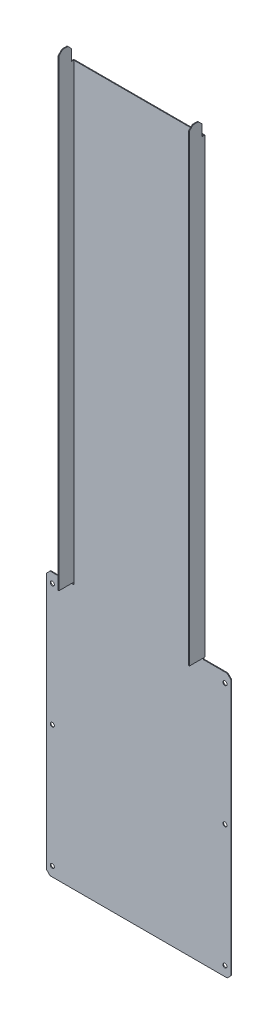
ISO-10303-21;
HEADER;
FILE_DESCRIPTION(('STEP AP214'),'2;1');
FILE_NAME('part.step','',(''),(''),'','','');
FILE_SCHEMA(('AUTOMOTIVE_DESIGN { 1 0 10303 214 1 1 1 1 }'));
ENDSEC;
DATA;
#1=APPLICATION_CONTEXT('core data for automotive mechanical design processes');
#2=APPLICATION_PROTOCOL_DEFINITION('international standard','automotive_design',2000,#1);
#3=PRODUCT_CONTEXT('',#1,'mechanical');
#4=PRODUCT('Part','Part','',(#3));
#5=PRODUCT_RELATED_PRODUCT_CATEGORY('part','',(#4));
#6=PRODUCT_DEFINITION_FORMATION('','',#4);
#7=PRODUCT_DEFINITION_CONTEXT('part definition',#1,'design');
#8=PRODUCT_DEFINITION('design','',#6,#7);
#9=PRODUCT_DEFINITION_SHAPE('','',#8);
#10=(LENGTH_UNIT() NAMED_UNIT(*) SI_UNIT(.MILLI.,.METRE.));
#11=(NAMED_UNIT(*) PLANE_ANGLE_UNIT() SI_UNIT($,.RADIAN.));
#12=(NAMED_UNIT(*) SI_UNIT($,.STERADIAN.) SOLID_ANGLE_UNIT());
#13=UNCERTAINTY_MEASURE_WITH_UNIT(LENGTH_MEASURE(1.E-05),#10,'distance_accuracy_value','');
#14=(GEOMETRIC_REPRESENTATION_CONTEXT(3) GLOBAL_UNCERTAINTY_ASSIGNED_CONTEXT((#13)) GLOBAL_UNIT_ASSIGNED_CONTEXT((#10,
#11,#12)) REPRESENTATION_CONTEXT('',''));
#15=CARTESIAN_POINT('',(0.,0.,0.));
#16=DIRECTION('',(0.,0.,1.));
#17=DIRECTION('',(1.,0.,0.));
#18=AXIS2_PLACEMENT_3D('',#15,#16,#17);
#19=CARTESIAN_POINT('',(87.5000000000001,181.,21.));
#20=DIRECTION('',(0.,-1.,0.));
#21=DIRECTION('',(0.,0.,-1.));
#22=AXIS2_PLACEMENT_3D('',#19,#20,#21);
#23=PLANE('',#22);
#24=DIRECTION('',(0.,0.,-1.));
#25=VECTOR('',#24,1.);
#26=CARTESIAN_POINT('',(87.5000000000002,181.,0.));
#27=LINE('',#26,#25);
#28=CARTESIAN_POINT('',(87.5000000000001,181.,0.));
#29=VERTEX_POINT('',#28);
#30=CARTESIAN_POINT('',(87.5000000000001,181.,1.));
#31=VERTEX_POINT('',#30);
#32=EDGE_CURVE('E310',#29,#31,#27,.F.);
#33=ORIENTED_EDGE('',*,*,#32,.F.);
#34=DIRECTION('',(1.,0.,0.));
#35=VECTOR('',#34,1.);
#36=CARTESIAN_POINT('',(88.0000000000001,181.,0.));
#37=LINE('',#36,#35);
#38=CARTESIAN_POINT('',(88.5000000000001,181.,0.));
#39=VERTEX_POINT('',#38);
#40=EDGE_CURVE('E361',#29,#39,#37,.T.);
#41=ORIENTED_EDGE('',*,*,#40,.T.);
#42=DIRECTION('',(0.,0.,1.));
#43=VECTOR('',#42,1.);
#44=CARTESIAN_POINT('',(88.5,181.,10.5));
#45=LINE('',#44,#43);
#46=CARTESIAN_POINT('',(88.5000000000001,181.,21.));
#47=VERTEX_POINT('',#46);
#48=EDGE_CURVE('E237',#39,#47,#45,.T.);
#49=ORIENTED_EDGE('',*,*,#48,.T.);
#50=DIRECTION('',(1.,0.,0.));
#51=VECTOR('',#50,1.);
#52=CARTESIAN_POINT('',(88.0000000000001,181.,21.));
#53=LINE('',#52,#51);
#54=CARTESIAN_POINT('',(87.5000000000001,181.,21.));
#55=VERTEX_POINT('',#54);
#56=EDGE_CURVE('E359',#55,#47,#53,.T.);
#57=ORIENTED_EDGE('',*,*,#56,.F.);
#58=DIRECTION('',(0.,0.,1.));
#59=VECTOR('',#58,1.);
#60=CARTESIAN_POINT('',(87.5000000000001,181.,11.));
#61=LINE('',#60,#59);
#62=EDGE_CURVE('E225',#31,#55,#61,.T.);
#63=ORIENTED_EDGE('',*,*,#62,.F.);
#64=EDGE_LOOP('',(#33,#41,#49,#57,#63));
#65=FACE_BOUND('',#64,.T.);
#66=ADVANCED_FACE('F16',(#65),#23,.T.);
#67=CARTESIAN_POINT('',(88.5000000000002,806.,21.));
#68=DIRECTION('',(0.,0.,1.));
#69=DIRECTION('',(-1.,0.,0.));
#70=AXIS2_PLACEMENT_3D('',#67,#68,#69);
#71=PLANE('',#70);
#72=DIRECTION('',(0.,1.,0.));
#73=VECTOR('',#72,1.);
#74=CARTESIAN_POINT('',(87.5000000000002,496.,21.));
#75=LINE('',#74,#73);
#76=CARTESIAN_POINT('',(87.5000000000002,806.,21.));
#77=VERTEX_POINT('',#76);
#78=EDGE_CURVE('E193',#55,#77,#75,.T.);
#79=ORIENTED_EDGE('',*,*,#78,.F.);
#80=ORIENTED_EDGE('',*,*,#56,.T.);
#81=DIRECTION('',(0.,1.,0.));
#82=VECTOR('',#81,1.);
#83=CARTESIAN_POINT('',(88.5000000000001,496.,21.));
#84=LINE('',#83,#82);
#85=CARTESIAN_POINT('',(88.5000000000002,806.,21.));
#86=VERTEX_POINT('',#85);
#87=EDGE_CURVE('E235',#47,#86,#84,.T.);
#88=ORIENTED_EDGE('',*,*,#87,.T.);
#89=DIRECTION('',(1.,0.,0.));
#90=VECTOR('',#89,1.);
#91=CARTESIAN_POINT('',(88.0000000000002,806.,21.));
#92=LINE('',#91,#90);
#93=EDGE_CURVE('E212',#77,#86,#92,.T.);
#94=ORIENTED_EDGE('',*,*,#93,.F.);
#95=EDGE_LOOP('',(#79,#80,#88,#94));
#96=FACE_BOUND('',#95,.T.);
#97=ADVANCED_FACE('F366',(#96),#71,.T.);
#98=CARTESIAN_POINT('',(88.5000000000002,811.,16.));
#99=DIRECTION('',(0.,0.70710678118655,0.707106781186545));
#100=DIRECTION('',(-1.,0.,0.));
#101=AXIS2_PLACEMENT_3D('',#98,#99,#100);
#102=PLANE('',#101);
#103=DIRECTION('',(0.,0.707106781186548,-0.707106781186547));
#104=VECTOR('',#103,1.);
#105=CARTESIAN_POINT('',(87.5000000000002,806.,21.));
#106=LINE('',#105,#104);
#107=CARTESIAN_POINT('',(87.5000000000002,811.,16.));
#108=VERTEX_POINT('',#107);
#109=EDGE_CURVE('E20',#77,#108,#106,.T.);
#110=ORIENTED_EDGE('',*,*,#109,.F.);
#111=ORIENTED_EDGE('',*,*,#93,.T.);
#112=DIRECTION('',(0.,-0.707106781186545,0.70710678118655));
#113=VECTOR('',#112,1.);
#114=CARTESIAN_POINT('',(88.5000000000002,811.,16.));
#115=LINE('',#114,#113);
#116=CARTESIAN_POINT('',(88.5000000000002,811.,16.));
#117=VERTEX_POINT('',#116);
#118=EDGE_CURVE('E207',#86,#117,#115,.F.);
#119=ORIENTED_EDGE('',*,*,#118,.T.);
#120=DIRECTION('',(1.,0.,0.));
#121=VECTOR('',#120,1.);
#122=CARTESIAN_POINT('',(88.0000000000002,811.,16.));
#123=LINE('',#122,#121);
#124=EDGE_CURVE('E204',#108,#117,#123,.T.);
#125=ORIENTED_EDGE('',*,*,#124,.F.);
#126=EDGE_LOOP('',(#110,#111,#119,#125));
#127=FACE_BOUND('',#126,.T.);
#128=ADVANCED_FACE('F205',(#127),#102,.T.);
#129=CARTESIAN_POINT('',(87.5000000000002,811.,9.));
#130=DIRECTION('',(0.,1.,0.));
#131=DIRECTION('',(0.,0.,1.));
#132=AXIS2_PLACEMENT_3D('',#129,#130,#131);
#133=PLANE('',#132);
#134=DIRECTION('',(0.,0.,-1.));
#135=VECTOR('',#134,1.);
#136=CARTESIAN_POINT('',(87.5000000000002,811.,11.));
#137=LINE('',#136,#135);
#138=CARTESIAN_POINT('',(87.5000000000002,811.,9.00000000000002));
#139=VERTEX_POINT('',#138);
#140=EDGE_CURVE('E200',#108,#139,#137,.T.);
#141=ORIENTED_EDGE('',*,*,#140,.F.);
#142=ORIENTED_EDGE('',*,*,#124,.T.);
#143=DIRECTION('',(0.,0.,-1.));
#144=VECTOR('',#143,1.);
#145=CARTESIAN_POINT('',(88.5000000000002,811.,10.5));
#146=LINE('',#145,#144);
#147=CARTESIAN_POINT('',(88.5000000000002,811.,9.00000000000004));
#148=VERTEX_POINT('',#147);
#149=EDGE_CURVE('E228',#117,#148,#146,.T.);
#150=ORIENTED_EDGE('',*,*,#149,.T.);
#151=DIRECTION('',(1.,0.,0.));
#152=VECTOR('',#151,1.);
#153=CARTESIAN_POINT('',(88.0000000000002,811.,9.00000000000004));
#154=LINE('',#153,#152);
#155=EDGE_CURVE('E211',#139,#148,#154,.T.);
#156=ORIENTED_EDGE('',*,*,#155,.F.);
#157=EDGE_LOOP('',(#141,#142,#150,#156));
#158=FACE_BOUND('',#157,.T.);
#159=ADVANCED_FACE('F214',(#158),#133,.T.);
#160=CARTESIAN_POINT('',(87.5000000000002,811.,9.00000000000004));
#161=DIRECTION('',(0.,0.70710678118655,-0.707106781186545));
#162=DIRECTION('',(1.,0.,0.));
#163=AXIS2_PLACEMENT_3D('',#160,#161,#162);
#164=PLANE('',#163);
#165=DIRECTION('',(0.,-0.707106781186548,-0.707106781186547));
#166=VECTOR('',#165,1.);
#167=CARTESIAN_POINT('',(87.5000000000002,811.,9.));
#168=LINE('',#167,#166);
#169=CARTESIAN_POINT('',(87.5000000000002,806.,4.));
#170=VERTEX_POINT('',#169);
#171=EDGE_CURVE('E216',#139,#170,#168,.T.);
#172=ORIENTED_EDGE('',*,*,#171,.F.);
#173=ORIENTED_EDGE('',*,*,#155,.T.);
#174=DIRECTION('',(0.,-0.707106781186545,-0.70710678118655));
#175=VECTOR('',#174,1.);
#176=CARTESIAN_POINT('',(88.5000000000002,811.,9.00000000000004));
#177=LINE('',#176,#175);
#178=CARTESIAN_POINT('',(88.5000000000002,806.,4.));
#179=VERTEX_POINT('',#178);
#180=EDGE_CURVE('E230',#148,#179,#177,.T.);
#181=ORIENTED_EDGE('',*,*,#180,.T.);
#182=DIRECTION('',(1.,0.,0.));
#183=VECTOR('',#182,1.);
#184=CARTESIAN_POINT('',(88.0000000000002,806.,4.));
#185=LINE('',#184,#183);
#186=EDGE_CURVE('E223',#170,#179,#185,.T.);
#187=ORIENTED_EDGE('',*,*,#186,.F.);
#188=EDGE_LOOP('',(#172,#173,#181,#187));
#189=FACE_BOUND('',#188,.T.);
#190=ADVANCED_FACE('F279',(#189),#164,.T.);
#191=CARTESIAN_POINT('',(87.5000000000002,806.,4.));
#192=DIRECTION('',(0.,0.,-1.));
#193=DIRECTION('',(1.,0.,0.));
#194=AXIS2_PLACEMENT_3D('',#191,#192,#193);
#195=PLANE('',#194);
#196=DIRECTION('',(0.,-1.,0.));
#197=VECTOR('',#196,1.);
#198=CARTESIAN_POINT('',(87.5000000000002,496.,4.));
#199=LINE('',#198,#197);
#200=CARTESIAN_POINT('',(87.5000000000002,791.,4.00000000000001));
#201=VERTEX_POINT('',#200);
#202=EDGE_CURVE('E218',#170,#201,#199,.T.);
#203=ORIENTED_EDGE('',*,*,#202,.F.);
#204=ORIENTED_EDGE('',*,*,#186,.T.);
#205=DIRECTION('',(0.,-1.,0.));
#206=VECTOR('',#205,1.);
#207=CARTESIAN_POINT('',(88.5000000000001,496.,4.));
#208=LINE('',#207,#206);
#209=CARTESIAN_POINT('',(88.5000000000002,791.,4.00000000000001));
#210=VERTEX_POINT('',#209);
#211=EDGE_CURVE('E231',#179,#210,#208,.T.);
#212=ORIENTED_EDGE('',*,*,#211,.T.);
#213=DIRECTION('',(-1.,0.,0.));
#214=VECTOR('',#213,1.);
#215=CARTESIAN_POINT('',(88.0000000000002,791.,4.00000000000001));
#216=LINE('',#215,#214);
#217=EDGE_CURVE('E222',#210,#201,#216,.T.);
#218=ORIENTED_EDGE('',*,*,#217,.T.);
#219=EDGE_LOOP('',(#203,#204,#212,#218));
#220=FACE_BOUND('',#219,.T.);
#221=ADVANCED_FACE('F287',(#220),#195,.T.);
#222=CARTESIAN_POINT('',(87.5000000000002,811.,21.));
#223=DIRECTION('',(-1.,0.,0.));
#224=DIRECTION('',(0.,0.,-1.));
#225=AXIS2_PLACEMENT_3D('',#222,#223,#224);
#226=PLANE('',#225);
#227=ORIENTED_EDGE('',*,*,#202,.T.);
#228=DIRECTION('',(0.,0.,1.));
#229=VECTOR('',#228,1.);
#230=CARTESIAN_POINT('',(87.5000000000002,791.,0.));
#231=LINE('',#230,#229);
#232=CARTESIAN_POINT('',(87.5000000000001,791.,1.));
#233=VERTEX_POINT('',#232);
#234=EDGE_CURVE('E291',#233,#201,#231,.T.);
#235=ORIENTED_EDGE('',*,*,#234,.F.);
#236=DIRECTION('',(0.,1.,0.));
#237=VECTOR('',#236,1.);
#238=CARTESIAN_POINT('',(87.5000000000001,296.924482555466,1.));
#239=LINE('',#238,#237);
#240=EDGE_CURVE('E330',#31,#233,#239,.T.);
#241=ORIENTED_EDGE('',*,*,#240,.F.);
#242=ORIENTED_EDGE('',*,*,#62,.T.);
#243=ORIENTED_EDGE('',*,*,#78,.T.);
#244=ORIENTED_EDGE('',*,*,#109,.T.);
#245=ORIENTED_EDGE('',*,*,#140,.T.);
#246=ORIENTED_EDGE('',*,*,#171,.T.);
#247=EDGE_LOOP('',(#227,#235,#241,#242,#243,#244,#245,#246));
#248=FACE_BOUND('',#247,.T.);
#249=ADVANCED_FACE('F198',(#248),#226,.T.);
#250=CARTESIAN_POINT('',(-87.5000000000002,494.50665867239,10.5526827030545));
#251=DIRECTION('',(1.,0.,0.));
#252=DIRECTION('',(0.,0.,-1.));
#253=AXIS2_PLACEMENT_3D('',#250,#251,#252);
#254=PLANE('',#253);
#255=DIRECTION('',(0.,1.,0.));
#256=VECTOR('',#255,1.);
#257=CARTESIAN_POINT('',(-87.5000000000001,806.,21.));
#258=LINE('',#257,#256);
#259=CARTESIAN_POINT('',(-87.5000000000001,181.,21.));
#260=VERTEX_POINT('',#259);
#261=CARTESIAN_POINT('',(-87.5000000000002,806.,21.));
#262=VERTEX_POINT('',#261);
#263=EDGE_CURVE('E342',#260,#262,#258,.T.);
#264=ORIENTED_EDGE('',*,*,#263,.F.);
#265=DIRECTION('',(0.,0.,-1.));
#266=VECTOR('',#265,1.);
#267=CARTESIAN_POINT('',(-87.5000000000001,181.,21.));
#268=LINE('',#267,#266);
#269=CARTESIAN_POINT('',(-87.5000000000001,181.,1.));
#270=VERTEX_POINT('',#269);
#271=EDGE_CURVE('E334',#270,#260,#268,.F.);
#272=ORIENTED_EDGE('',*,*,#271,.F.);
#273=DIRECTION('',(0.,1.,0.));
#274=VECTOR('',#273,1.);
#275=CARTESIAN_POINT('',(-87.5000000000002,296.924482555466,1.));
#276=LINE('',#275,#274);
#277=CARTESIAN_POINT('',(-87.5000000000002,791.,1.));
#278=VERTEX_POINT('',#277);
#279=EDGE_CURVE('E327',#278,#270,#276,.F.);
#280=ORIENTED_EDGE('',*,*,#279,.F.);
#281=DIRECTION('',(0.,0.,1.));
#282=VECTOR('',#281,1.);
#283=CARTESIAN_POINT('',(-87.5000000000002,791.,0.));
#284=LINE('',#283,#282);
#285=CARTESIAN_POINT('',(-87.5000000000002,791.,4.00000000000001));
#286=VERTEX_POINT('',#285);
#287=EDGE_CURVE('E444',#286,#278,#284,.F.);
#288=ORIENTED_EDGE('',*,*,#287,.F.);
#289=DIRECTION('',(0.,1.,0.));
#290=VECTOR('',#289,1.);
#291=CARTESIAN_POINT('',(-87.5000000000002,791.,4.00000000000001));
#292=LINE('',#291,#290);
#293=CARTESIAN_POINT('',(-87.5000000000002,806.,4.));
#294=VERTEX_POINT('',#293);
#295=EDGE_CURVE('E227',#294,#286,#292,.F.);
#296=ORIENTED_EDGE('',*,*,#295,.F.);
#297=DIRECTION('',(0.,0.707106781186548,0.707106781186547));
#298=VECTOR('',#297,1.);
#299=CARTESIAN_POINT('',(-87.5000000000002,806.,4.));
#300=LINE('',#299,#298);
#301=CARTESIAN_POINT('',(-87.5000000000002,811.,9.));
#302=VERTEX_POINT('',#301);
#303=EDGE_CURVE('E354',#302,#294,#300,.F.);
#304=ORIENTED_EDGE('',*,*,#303,.F.);
#305=DIRECTION('',(0.,0.,1.));
#306=VECTOR('',#305,1.);
#307=CARTESIAN_POINT('',(-87.5000000000002,811.,9.));
#308=LINE('',#307,#306);
#309=CARTESIAN_POINT('',(-87.5000000000002,811.,16.));
#310=VERTEX_POINT('',#309);
#311=EDGE_CURVE('E350',#310,#302,#308,.F.);
#312=ORIENTED_EDGE('',*,*,#311,.F.);
#313=DIRECTION('',(0.,-0.707106781186548,0.707106781186548));
#314=VECTOR('',#313,1.);
#315=CARTESIAN_POINT('',(-87.5000000000002,811.,16.));
#316=LINE('',#315,#314);
#317=EDGE_CURVE('E346',#262,#310,#316,.F.);
#318=ORIENTED_EDGE('',*,*,#317,.F.);
#319=EDGE_LOOP('',(#264,#272,#280,#288,#296,#304,#312,#318));
#320=FACE_BOUND('',#319,.T.);
#321=ADVANCED_FACE('F451',(#320),#254,.T.);
#322=CARTESIAN_POINT('',(-87.5000000000002,791.,4.00000000000001));
#323=DIRECTION('',(0.,0.,-1.));
#324=DIRECTION('',(-1.,0.,0.));
#325=AXIS2_PLACEMENT_3D('',#322,#323,#324);
#326=PLANE('',#325);
#327=ORIENTED_EDGE('',*,*,#295,.T.);
#328=DIRECTION('',(1.,0.,0.));
#329=VECTOR('',#328,1.);
#330=CARTESIAN_POINT('',(0.,791.,4.00000000000001));
#331=LINE('',#330,#329);
#332=CARTESIAN_POINT('',(-88.5000000000002,791.,4.00000000000001));
#333=VERTEX_POINT('',#332);
#334=EDGE_CURVE('E299',#333,#286,#331,.T.);
#335=ORIENTED_EDGE('',*,*,#334,.F.);
#336=DIRECTION('',(0.,1.,0.));
#337=VECTOR('',#336,1.);
#338=CARTESIAN_POINT('',(-88.5000000000001,494.50665867239,4.00000000000001));
#339=LINE('',#338,#337);
#340=CARTESIAN_POINT('',(-88.5000000000002,806.,4.));
#341=VERTEX_POINT('',#340);
#342=EDGE_CURVE('E441',#333,#341,#339,.T.);
#343=ORIENTED_EDGE('',*,*,#342,.T.);
#344=DIRECTION('',(1.,0.,0.));
#345=VECTOR('',#344,1.);
#346=CARTESIAN_POINT('',(-87.5000000000002,806.,4.));
#347=LINE('',#346,#345);
#348=EDGE_CURVE('E352',#294,#341,#347,.F.);
#349=ORIENTED_EDGE('',*,*,#348,.F.);
#350=EDGE_LOOP('',(#327,#335,#343,#349));
#351=FACE_BOUND('',#350,.T.);
#352=ADVANCED_FACE('F531',(#351),#326,.T.);
#353=CARTESIAN_POINT('',(-87.5000000000002,806.,4.));
#354=DIRECTION('',(0.,0.707106781186547,-0.707106781186548));
#355=DIRECTION('',(0.,0.707106781186548,0.707106781186547));
#356=AXIS2_PLACEMENT_3D('',#353,#354,#355);
#357=PLANE('',#356);
#358=ORIENTED_EDGE('',*,*,#303,.T.);
#359=ORIENTED_EDGE('',*,*,#348,.T.);
#360=DIRECTION('',(0.,0.707106781186548,0.707106781186547));
#361=VECTOR('',#360,1.);
#362=CARTESIAN_POINT('',(-88.5000000000001,806.,4.));
#363=LINE('',#362,#361);
#364=CARTESIAN_POINT('',(-88.5000000000002,811.,9.));
#365=VERTEX_POINT('',#364);
#366=EDGE_CURVE('E438',#341,#365,#363,.T.);
#367=ORIENTED_EDGE('',*,*,#366,.T.);
#368=DIRECTION('',(1.,0.,0.));
#369=VECTOR('',#368,1.);
#370=CARTESIAN_POINT('',(-87.5000000000002,811.,9.));
#371=LINE('',#370,#369);
#372=EDGE_CURVE('E348',#302,#365,#371,.F.);
#373=ORIENTED_EDGE('',*,*,#372,.F.);
#374=EDGE_LOOP('',(#358,#359,#367,#373));
#375=FACE_BOUND('',#374,.T.);
#376=ADVANCED_FACE('F530',(#375),#357,.T.);
#377=CARTESIAN_POINT('',(-87.5000000000002,811.,9.));
#378=DIRECTION('',(0.,1.,0.));
#379=DIRECTION('',(0.,0.,1.));
#380=AXIS2_PLACEMENT_3D('',#377,#378,#379);
#381=PLANE('',#380);
#382=ORIENTED_EDGE('',*,*,#311,.T.);
#383=ORIENTED_EDGE('',*,*,#372,.T.);
#384=DIRECTION('',(0.,0.,-1.));
#385=VECTOR('',#384,1.);
#386=CARTESIAN_POINT('',(-88.5000000000001,811.,10.5526827030545));
#387=LINE('',#386,#385);
#388=CARTESIAN_POINT('',(-88.5000000000002,811.,16.));
#389=VERTEX_POINT('',#388);
#390=EDGE_CURVE('E435',#365,#389,#387,.F.);
#391=ORIENTED_EDGE('',*,*,#390,.T.);
#392=DIRECTION('',(1.,0.,0.));
#393=VECTOR('',#392,1.);
#394=CARTESIAN_POINT('',(-87.5000000000002,811.,16.));
#395=LINE('',#394,#393);
#396=EDGE_CURVE('E344',#310,#389,#395,.F.);
#397=ORIENTED_EDGE('',*,*,#396,.F.);
#398=EDGE_LOOP('',(#382,#383,#391,#397));
#399=FACE_BOUND('',#398,.T.);
#400=ADVANCED_FACE('F526',(#399),#381,.T.);
#401=CARTESIAN_POINT('',(-87.5000000000002,811.,16.));
#402=DIRECTION('',(0.,0.707106781186548,0.707106781186548));
#403=DIRECTION('',(0.,-0.707106781186548,0.707106781186548));
#404=AXIS2_PLACEMENT_3D('',#401,#402,#403);
#405=PLANE('',#404);
#406=ORIENTED_EDGE('',*,*,#317,.T.);
#407=ORIENTED_EDGE('',*,*,#396,.T.);
#408=DIRECTION('',(0.,-0.707106781186548,0.707106781186547));
#409=VECTOR('',#408,1.);
#410=CARTESIAN_POINT('',(-88.5000000000001,811.,16.));
#411=LINE('',#410,#409);
#412=CARTESIAN_POINT('',(-88.5000000000002,806.,21.));
#413=VERTEX_POINT('',#412);
#414=EDGE_CURVE('E432',#389,#413,#411,.T.);
#415=ORIENTED_EDGE('',*,*,#414,.T.);
#416=DIRECTION('',(1.,0.,0.));
#417=VECTOR('',#416,1.);
#418=CARTESIAN_POINT('',(-87.5000000000002,806.,21.));
#419=LINE('',#418,#417);
#420=EDGE_CURVE('E340',#262,#413,#419,.F.);
#421=ORIENTED_EDGE('',*,*,#420,.F.);
#422=EDGE_LOOP('',(#406,#407,#415,#421));
#423=FACE_BOUND('',#422,.T.);
#424=ADVANCED_FACE('F522',(#423),#405,.T.);
#425=CARTESIAN_POINT('',(-87.5000000000002,806.,21.));
#426=DIRECTION('',(0.,0.,1.));
#427=DIRECTION('',(1.,0.,0.));
#428=AXIS2_PLACEMENT_3D('',#425,#426,#427);
#429=PLANE('',#428);
#430=ORIENTED_EDGE('',*,*,#263,.T.);
#431=ORIENTED_EDGE('',*,*,#420,.T.);
#432=DIRECTION('',(0.,1.,0.));
#433=VECTOR('',#432,1.);
#434=CARTESIAN_POINT('',(-88.5000000000001,494.50665867239,21.));
#435=LINE('',#434,#433);
#436=CARTESIAN_POINT('',(-88.5000000000001,181.,21.));
#437=VERTEX_POINT('',#436);
#438=EDGE_CURVE('E429',#413,#437,#435,.F.);
#439=ORIENTED_EDGE('',*,*,#438,.T.);
#440=DIRECTION('',(1.,0.,0.));
#441=VECTOR('',#440,1.);
#442=CARTESIAN_POINT('',(-87.5000000000001,181.,21.));
#443=LINE('',#442,#441);
#444=EDGE_CURVE('E332',#260,#437,#443,.F.);
#445=ORIENTED_EDGE('',*,*,#444,.F.);
#446=EDGE_LOOP('',(#430,#431,#439,#445));
#447=FACE_BOUND('',#446,.T.);
#448=ADVANCED_FACE('F516',(#447),#429,.T.);
#449=CARTESIAN_POINT('',(-87.5000000000001,181.,21.));
#450=DIRECTION('',(0.,-1.,0.));
#451=DIRECTION('',(0.,0.,-1.));
#452=AXIS2_PLACEMENT_3D('',#449,#450,#451);
#453=PLANE('',#452);
#454=ORIENTED_EDGE('',*,*,#271,.T.);
#455=ORIENTED_EDGE('',*,*,#444,.T.);
#456=DIRECTION('',(0.,0.,-1.));
#457=VECTOR('',#456,1.);
#458=CARTESIAN_POINT('',(-88.5000000000001,181.,10.5526827030545));
#459=LINE('',#458,#457);
#460=CARTESIAN_POINT('',(-88.5000000000001,181.,0.));
#461=VERTEX_POINT('',#460);
#462=EDGE_CURVE('E426',#437,#461,#459,.T.);
#463=ORIENTED_EDGE('',*,*,#462,.T.);
#464=DIRECTION('',(1.,0.,0.));
#465=VECTOR('',#464,1.);
#466=CARTESIAN_POINT('',(-87.5000000000001,181.,0.));
#467=LINE('',#466,#465);
#468=CARTESIAN_POINT('',(-87.5000000000001,181.,0.));
#469=VERTEX_POINT('',#468);
#470=EDGE_CURVE('E338',#461,#469,#467,.T.);
#471=ORIENTED_EDGE('',*,*,#470,.T.);
#472=DIRECTION('',(0.,0.,-1.));
#473=VECTOR('',#472,1.);
#474=CARTESIAN_POINT('',(-87.5000000000001,181.,21.));
#475=LINE('',#474,#473);
#476=EDGE_CURVE('E336',#469,#270,#475,.F.);
#477=ORIENTED_EDGE('',*,*,#476,.T.);
#478=EDGE_LOOP('',(#454,#455,#463,#471,#477));
#479=FACE_BOUND('',#478,.T.);
#480=ADVANCED_FACE('F513',(#479),#453,.T.);
#481=CARTESIAN_POINT('',(51.679387924832,296.924482555466,1.));
#482=DIRECTION('',(0.,0.,1.));
#483=DIRECTION('',(1.,0.,0.));
#484=AXIS2_PLACEMENT_3D('',#481,#482,#483);
#485=PLANE('',#484);
#486=CARTESIAN_POINT('',(-116.453,165.,0.99999999999989));
#487=DIRECTION('',(0.,0.,1.));
#488=DIRECTION('',(1.,0.,0.));
#489=AXIS2_PLACEMENT_3D('',#486,#487,#488);
#490=CIRCLE('',#489,2.75);
#491=CARTESIAN_POINT('',(-113.703,165.,0.99999999999989));
#492=VERTEX_POINT('',#491);
#493=EDGE_CURVE('E254',#492,#492,#490,.F.);
#494=ORIENTED_EDGE('',*,*,#493,.T.);
#495=EDGE_LOOP('',(#494));
#496=FACE_BOUND('',#495,.T.);
#497=CARTESIAN_POINT('',(-116.453,0.,0.99999999999989));
#498=DIRECTION('',(0.,0.,1.));
#499=DIRECTION('',(1.,0.,0.));
#500=AXIS2_PLACEMENT_3D('',#497,#498,#499);
#501=CIRCLE('',#500,2.75);
#502=CARTESIAN_POINT('',(-113.703,0.,0.99999999999989));
#503=VERTEX_POINT('',#502);
#504=EDGE_CURVE('E258',#503,#503,#501,.F.);
#505=ORIENTED_EDGE('',*,*,#504,.T.);
#506=EDGE_LOOP('',(#505));
#507=FACE_BOUND('',#506,.T.);
#508=CARTESIAN_POINT('',(-116.453,-165.,0.99999999999989));
#509=DIRECTION('',(0.,0.,1.));
#510=DIRECTION('',(1.,0.,0.));
#511=AXIS2_PLACEMENT_3D('',#508,#509,#510);
#512=CIRCLE('',#511,2.75);
#513=CARTESIAN_POINT('',(-113.703,-165.,0.99999999999989));
#514=VERTEX_POINT('',#513);
#515=EDGE_CURVE('E261',#514,#514,#512,.F.);
#516=ORIENTED_EDGE('',*,*,#515,.T.);
#517=EDGE_LOOP('',(#516));
#518=FACE_BOUND('',#517,.T.);
#519=CARTESIAN_POINT('',(116.453,165.,0.99999999999989));
#520=DIRECTION('',(0.,0.,1.));
#521=DIRECTION('',(1.,0.,0.));
#522=AXIS2_PLACEMENT_3D('',#519,#520,#521);
#523=CIRCLE('',#522,2.75);
#524=CARTESIAN_POINT('',(119.203,165.,0.99999999999989));
#525=VERTEX_POINT('',#524);
#526=EDGE_CURVE('E264',#525,#525,#523,.F.);
#527=ORIENTED_EDGE('',*,*,#526,.T.);
#528=EDGE_LOOP('',(#527));
#529=FACE_BOUND('',#528,.T.);
#530=CARTESIAN_POINT('',(116.453,0.,0.99999999999989));
#531=DIRECTION('',(0.,0.,1.));
#532=DIRECTION('',(1.,0.,0.));
#533=AXIS2_PLACEMENT_3D('',#530,#531,#532);
#534=CIRCLE('',#533,2.75);
#535=CARTESIAN_POINT('',(119.203,0.,0.99999999999989));
#536=VERTEX_POINT('',#535);
#537=EDGE_CURVE('E267',#536,#536,#534,.F.);
#538=ORIENTED_EDGE('',*,*,#537,.T.);
#539=EDGE_LOOP('',(#538));
#540=FACE_BOUND('',#539,.T.);
#541=CARTESIAN_POINT('',(116.453,-165.,0.99999999999989));
#542=DIRECTION('',(0.,0.,1.));
#543=DIRECTION('',(1.,0.,0.));
#544=AXIS2_PLACEMENT_3D('',#541,#542,#543);
#545=CIRCLE('',#544,2.75);
#546=CARTESIAN_POINT('',(119.203,-165.,0.99999999999989));
#547=VERTEX_POINT('',#546);
#548=EDGE_CURVE('E270',#547,#547,#545,.F.);
#549=ORIENTED_EDGE('',*,*,#548,.T.);
#550=EDGE_LOOP('',(#549));
#551=FACE_BOUND('',#550,.T.);
#552=DIRECTION('',(0.,1.,0.));
#553=VECTOR('',#552,1.);
#554=CARTESIAN_POINT('',(-124.5,-173.,1.));
#555=LINE('',#554,#553);
#556=CARTESIAN_POINT('',(-124.5,-173.,1.));
#557=VERTEX_POINT('',#556);
#558=CARTESIAN_POINT('',(-124.5,173.,1.));
#559=VERTEX_POINT('',#558);
#560=EDGE_CURVE('E410',#557,#559,#555,.T.);
#561=ORIENTED_EDGE('',*,*,#560,.F.);
#562=DIRECTION('',(0.707106781186548,-0.707106781186548,0.));
#563=VECTOR('',#562,1.);
#564=CARTESIAN_POINT('',(-119.5,-178.,1.));
#565=LINE('',#564,#563);
#566=CARTESIAN_POINT('',(-119.5,-178.,1.));
#567=VERTEX_POINT('',#566);
#568=EDGE_CURVE('E406',#567,#557,#565,.F.);
#569=ORIENTED_EDGE('',*,*,#568,.F.);
#570=DIRECTION('',(1.,0.,0.));
#571=VECTOR('',#570,1.);
#572=CARTESIAN_POINT('',(119.5,-178.,1.));
#573=LINE('',#572,#571);
#574=CARTESIAN_POINT('',(119.5,-178.,1.));
#575=VERTEX_POINT('',#574);
#576=EDGE_CURVE('E402',#575,#567,#573,.F.);
#577=ORIENTED_EDGE('',*,*,#576,.F.);
#578=DIRECTION('',(0.707106781186548,0.707106781186548,0.));
#579=VECTOR('',#578,1.);
#580=CARTESIAN_POINT('',(124.5,-173.,1.));
#581=LINE('',#580,#579);
#582=CARTESIAN_POINT('',(124.5,-173.,1.));
#583=VERTEX_POINT('',#582);
#584=EDGE_CURVE('E325',#583,#575,#581,.F.);
#585=ORIENTED_EDGE('',*,*,#584,.F.);
#586=DIRECTION('',(0.,1.,0.));
#587=VECTOR('',#586,1.);
#588=CARTESIAN_POINT('',(124.5,173.,1.));
#589=LINE('',#588,#587);
#590=CARTESIAN_POINT('',(124.5,173.,1.));
#591=VERTEX_POINT('',#590);
#592=EDGE_CURVE('E323',#591,#583,#589,.F.);
#593=ORIENTED_EDGE('',*,*,#592,.F.);
#594=DIRECTION('',(-0.707106781186548,0.707106781186548,0.));
#595=VECTOR('',#594,1.);
#596=CARTESIAN_POINT('',(119.5,178.,1.));
#597=LINE('',#596,#595);
#598=CARTESIAN_POINT('',(119.5,178.,1.));
#599=VERTEX_POINT('',#598);
#600=EDGE_CURVE('E319',#599,#591,#597,.F.);
#601=ORIENTED_EDGE('',*,*,#600,.F.);
#602=DIRECTION('',(1.,0.,0.));
#603=VECTOR('',#602,1.);
#604=CARTESIAN_POINT('',(87.5000000000001,178.,1.));
#605=LINE('',#604,#603);
#606=CARTESIAN_POINT('',(87.5000000000001,178.,1.));
#607=VERTEX_POINT('',#606);
#608=EDGE_CURVE('E315',#607,#599,#605,.T.);
#609=ORIENTED_EDGE('',*,*,#608,.F.);
#610=DIRECTION('',(0.,1.,0.));
#611=VECTOR('',#610,1.);
#612=CARTESIAN_POINT('',(87.5000000000002,791.,1.));
#613=LINE('',#612,#611);
#614=EDGE_CURVE('E308',#31,#607,#613,.F.);
#615=ORIENTED_EDGE('',*,*,#614,.F.);
#616=ORIENTED_EDGE('',*,*,#240,.T.);
#617=DIRECTION('',(1.,0.,0.));
#618=VECTOR('',#617,1.);
#619=CARTESIAN_POINT('',(0.,791.,1.));
#620=LINE('',#619,#618);
#621=EDGE_CURVE('E234',#278,#233,#620,.T.);
#622=ORIENTED_EDGE('',*,*,#621,.F.);
#623=ORIENTED_EDGE('',*,*,#279,.T.);
#624=DIRECTION('',(0.,1.,0.));
#625=VECTOR('',#624,1.);
#626=CARTESIAN_POINT('',(-87.5000000000001,178.,1.));
#627=LINE('',#626,#625);
#628=CARTESIAN_POINT('',(-87.5000000000001,178.,1.));
#629=VERTEX_POINT('',#628);
#630=EDGE_CURVE('E420',#629,#270,#627,.T.);
#631=ORIENTED_EDGE('',*,*,#630,.F.);
#632=DIRECTION('',(1.,0.,0.));
#633=VECTOR('',#632,1.);
#634=CARTESIAN_POINT('',(-119.5,178.,1.));
#635=LINE('',#634,#633);
#636=CARTESIAN_POINT('',(-119.5,178.,1.));
#637=VERTEX_POINT('',#636);
#638=EDGE_CURVE('E418',#637,#629,#635,.T.);
#639=ORIENTED_EDGE('',*,*,#638,.F.);
#640=DIRECTION('',(-0.707106781186548,-0.707106781186548,0.));
#641=VECTOR('',#640,1.);
#642=CARTESIAN_POINT('',(-124.5,173.,1.));
#643=LINE('',#642,#641);
#644=EDGE_CURVE('E414',#559,#637,#643,.F.);
#645=ORIENTED_EDGE('',*,*,#644,.F.);
#646=EDGE_LOOP('',(#561,#569,#577,#585,#593,#601,#609,#615,#616,#622,#623,#631,#639,#645));
#647=FACE_BOUND('',#646,.T.);
#648=ADVANCED_FACE('F458',(#496,#507,#518,#529,#540,#551,#647),#485,.T.);
#649=CARTESIAN_POINT('',(124.5,-173.,0.));
#650=DIRECTION('',(0.707106781186548,-0.707106781186548,0.));
#651=DIRECTION('',(0.707106781186548,0.707106781186548,0.));
#652=AXIS2_PLACEMENT_3D('',#649,#650,#651);
#653=PLANE('',#652);
#654=DIRECTION('',(0.707106781186546,0.707106781186548,0.));
#655=VECTOR('',#654,1.);
#656=CARTESIAN_POINT('',(119.5,-178.,0.));
#657=LINE('',#656,#655);
#658=CARTESIAN_POINT('',(119.5,-178.,0.));
#659=VERTEX_POINT('',#658);
#660=CARTESIAN_POINT('',(124.5,-173.,0.));
#661=VERTEX_POINT('',#660);
#662=EDGE_CURVE('E257',#659,#661,#657,.T.);
#663=ORIENTED_EDGE('',*,*,#662,.T.);
#664=DIRECTION('',(0.,0.,-1.));
#665=VECTOR('',#664,1.);
#666=CARTESIAN_POINT('',(124.5,-173.,0.));
#667=LINE('',#666,#665);
#668=EDGE_CURVE('E321',#583,#661,#667,.T.);
#669=ORIENTED_EDGE('',*,*,#668,.F.);
#670=ORIENTED_EDGE('',*,*,#584,.T.);
#671=DIRECTION('',(0.,0.,-1.));
#672=VECTOR('',#671,1.);
#673=CARTESIAN_POINT('',(119.5,-178.,0.));
#674=LINE('',#673,#672);
#675=EDGE_CURVE('E273',#659,#575,#674,.F.);
#676=ORIENTED_EDGE('',*,*,#675,.F.);
#677=EDGE_LOOP('',(#663,#669,#670,#676));
#678=FACE_BOUND('',#677,.T.);
#679=ADVANCED_FACE('F482',(#678),#653,.T.);
#680=CARTESIAN_POINT('',(124.5,173.,0.));
#681=DIRECTION('',(1.,0.,0.));
#682=DIRECTION('',(0.,0.,-1.));
#683=AXIS2_PLACEMENT_3D('',#680,#681,#682);
#684=PLANE('',#683);
#685=DIRECTION('',(0.,1.,0.));
#686=VECTOR('',#685,1.);
#687=CARTESIAN_POINT('',(124.5,296.924482555466,0.));
#688=LINE('',#687,#686);
#689=CARTESIAN_POINT('',(124.5,173.,0.));
#690=VERTEX_POINT('',#689);
#691=EDGE_CURVE('E394',#661,#690,#688,.T.);
#692=ORIENTED_EDGE('',*,*,#691,.T.);
#693=DIRECTION('',(0.,0.,1.));
#694=VECTOR('',#693,1.);
#695=CARTESIAN_POINT('',(124.5,173.,0.));
#696=LINE('',#695,#694);
#697=EDGE_CURVE('E317',#591,#690,#696,.F.);
#698=ORIENTED_EDGE('',*,*,#697,.F.);
#699=ORIENTED_EDGE('',*,*,#592,.T.);
#700=ORIENTED_EDGE('',*,*,#668,.T.);
#701=EDGE_LOOP('',(#692,#698,#699,#700));
#702=FACE_BOUND('',#701,.T.);
#703=ADVANCED_FACE('F478',(#702),#684,.T.);
#704=CARTESIAN_POINT('',(119.5,178.,0.));
#705=DIRECTION('',(0.707106781186548,0.707106781186548,0.));
#706=DIRECTION('',(-0.707106781186548,0.707106781186548,0.));
#707=AXIS2_PLACEMENT_3D('',#704,#705,#706);
#708=PLANE('',#707);
#709=DIRECTION('',(-0.707106781186548,0.707106781186547,0.));
#710=VECTOR('',#709,1.);
#711=CARTESIAN_POINT('',(124.5,173.,0.));
#712=LINE('',#711,#710);
#713=CARTESIAN_POINT('',(119.5,178.,0.));
#714=VERTEX_POINT('',#713);
#715=EDGE_CURVE('E391',#690,#714,#712,.T.);
#716=ORIENTED_EDGE('',*,*,#715,.T.);
#717=DIRECTION('',(0.,0.,1.));
#718=VECTOR('',#717,1.);
#719=CARTESIAN_POINT('',(119.5,178.,0.));
#720=LINE('',#719,#718);
#721=EDGE_CURVE('E313',#599,#714,#720,.F.);
#722=ORIENTED_EDGE('',*,*,#721,.F.);
#723=ORIENTED_EDGE('',*,*,#600,.T.);
#724=ORIENTED_EDGE('',*,*,#697,.T.);
#725=EDGE_LOOP('',(#716,#722,#723,#724));
#726=FACE_BOUND('',#725,.T.);
#727=ADVANCED_FACE('F473',(#726),#708,.T.);
#728=CARTESIAN_POINT('',(87.5000000000001,178.,0.));
#729=DIRECTION('',(0.,1.,0.));
#730=DIRECTION('',(0.,0.,1.));
#731=AXIS2_PLACEMENT_3D('',#728,#729,#730);
#732=PLANE('',#731);
#733=DIRECTION('',(1.,0.,0.));
#734=VECTOR('',#733,1.);
#735=CARTESIAN_POINT('',(51.679387924832,178.,0.));
#736=LINE('',#735,#734);
#737=CARTESIAN_POINT('',(87.5000000000001,178.,0.));
#738=VERTEX_POINT('',#737);
#739=EDGE_CURVE('E385',#714,#738,#736,.F.);
#740=ORIENTED_EDGE('',*,*,#739,.T.);
#741=DIRECTION('',(0.,0.,-1.));
#742=VECTOR('',#741,1.);
#743=CARTESIAN_POINT('',(87.5000000000002,178.,0.));
#744=LINE('',#743,#742);
#745=EDGE_CURVE('E306',#607,#738,#744,.T.);
#746=ORIENTED_EDGE('',*,*,#745,.F.);
#747=ORIENTED_EDGE('',*,*,#608,.T.);
#748=ORIENTED_EDGE('',*,*,#721,.T.);
#749=EDGE_LOOP('',(#740,#746,#747,#748));
#750=FACE_BOUND('',#749,.T.);
#751=ADVANCED_FACE('F470',(#750),#732,.T.);
#752=CARTESIAN_POINT('',(87.5000000000002,791.,0.));
#753=DIRECTION('',(1.,0.,0.));
#754=DIRECTION('',(0.,0.,-1.));
#755=AXIS2_PLACEMENT_3D('',#752,#753,#754);
#756=PLANE('',#755);
#757=ORIENTED_EDGE('',*,*,#745,.T.);
#758=DIRECTION('',(0.,1.,0.));
#759=VECTOR('',#758,1.);
#760=CARTESIAN_POINT('',(87.5000000000001,296.924482555466,0.));
#761=LINE('',#760,#759);
#762=EDGE_CURVE('E380',#738,#29,#761,.T.);
#763=ORIENTED_EDGE('',*,*,#762,.T.);
#764=ORIENTED_EDGE('',*,*,#32,.T.);
#765=ORIENTED_EDGE('',*,*,#614,.T.);
#766=EDGE_LOOP('',(#757,#763,#764,#765));
#767=FACE_BOUND('',#766,.T.);
#768=ADVANCED_FACE('F466',(#767),#756,.T.);
#769=CARTESIAN_POINT('',(88.5000000000002,811.,21.));
#770=DIRECTION('',(-1.,0.,0.));
#771=DIRECTION('',(0.,0.,-1.));
#772=AXIS2_PLACEMENT_3D('',#769,#770,#771);
#773=PLANE('',#772);
#774=ORIENTED_EDGE('',*,*,#211,.F.);
#775=ORIENTED_EDGE('',*,*,#180,.F.);
#776=ORIENTED_EDGE('',*,*,#149,.F.);
#777=ORIENTED_EDGE('',*,*,#118,.F.);
#778=ORIENTED_EDGE('',*,*,#87,.F.);
#779=ORIENTED_EDGE('',*,*,#48,.F.);
#780=DIRECTION('',(0.,1.,0.));
#781=VECTOR('',#780,1.);
#782=CARTESIAN_POINT('',(88.5,296.924482555466,0.));
#783=LINE('',#782,#781);
#784=CARTESIAN_POINT('',(88.5000000000001,791.,0.));
#785=VERTEX_POINT('',#784);
#786=EDGE_CURVE('E371',#39,#785,#783,.T.);
#787=ORIENTED_EDGE('',*,*,#786,.T.);
#788=DIRECTION('',(0.,0.,1.));
#789=VECTOR('',#788,1.);
#790=CARTESIAN_POINT('',(88.5000000000002,791.,0.));
#791=LINE('',#790,#789);
#792=EDGE_CURVE('E285',#210,#785,#791,.F.);
#793=ORIENTED_EDGE('',*,*,#792,.F.);
#794=EDGE_LOOP('',(#774,#775,#776,#777,#778,#779,#787,#793));
#795=FACE_BOUND('',#794,.T.);
#796=ADVANCED_FACE('F18',(#795),#773,.F.);
#797=CARTESIAN_POINT('',(0.,791.,0.));
#798=DIRECTION('',(0.,1.,0.));
#799=DIRECTION('',(0.,0.,1.));
#800=AXIS2_PLACEMENT_3D('',#797,#798,#799);
#801=PLANE('',#800);
#802=ORIENTED_EDGE('',*,*,#334,.T.);
#803=ORIENTED_EDGE('',*,*,#287,.T.);
#804=ORIENTED_EDGE('',*,*,#621,.T.);
#805=ORIENTED_EDGE('',*,*,#234,.T.);
#806=ORIENTED_EDGE('',*,*,#217,.F.);
#807=ORIENTED_EDGE('',*,*,#792,.T.);
#808=DIRECTION('',(1.,0.,0.));
#809=VECTOR('',#808,1.);
#810=CARTESIAN_POINT('',(51.679387924832,791.,0.));
#811=LINE('',#810,#809);
#812=CARTESIAN_POINT('',(-88.5000000000002,791.,0.));
#813=VERTEX_POINT('',#812);
#814=EDGE_CURVE('E379',#785,#813,#811,.F.);
#815=ORIENTED_EDGE('',*,*,#814,.T.);
#816=DIRECTION('',(0.,0.,-1.));
#817=VECTOR('',#816,1.);
#818=CARTESIAN_POINT('',(-88.5000000000001,791.,10.5526827030545));
#819=LINE('',#818,#817);
#820=EDGE_CURVE('E423',#813,#333,#819,.F.);
#821=ORIENTED_EDGE('',*,*,#820,.T.);
#822=EDGE_LOOP('',(#802,#803,#804,#805,#806,#807,#815,#821));
#823=FACE_BOUND('',#822,.T.);
#824=ADVANCED_FACE('F295',(#823),#801,.T.);
#825=CARTESIAN_POINT('',(-88.5000000000001,494.50665867239,10.5526827030545));
#826=DIRECTION('',(1.,0.,0.));
#827=DIRECTION('',(0.,0.,-1.));
#828=AXIS2_PLACEMENT_3D('',#825,#826,#827);
#829=PLANE('',#828);
#830=DIRECTION('',(0.,1.,0.));
#831=VECTOR('',#830,1.);
#832=CARTESIAN_POINT('',(-88.5000000000002,296.924482555466,0.));
#833=LINE('',#832,#831);
#834=EDGE_CURVE('E382',#813,#461,#833,.F.);
#835=ORIENTED_EDGE('',*,*,#834,.T.);
#836=ORIENTED_EDGE('',*,*,#462,.F.);
#837=ORIENTED_EDGE('',*,*,#438,.F.);
#838=ORIENTED_EDGE('',*,*,#414,.F.);
#839=ORIENTED_EDGE('',*,*,#390,.F.);
#840=ORIENTED_EDGE('',*,*,#366,.F.);
#841=ORIENTED_EDGE('',*,*,#342,.F.);
#842=ORIENTED_EDGE('',*,*,#820,.F.);
#843=EDGE_LOOP('',(#835,#836,#837,#838,#839,#840,#841,#842));
#844=FACE_BOUND('',#843,.T.);
#845=ADVANCED_FACE('F507',(#844),#829,.F.);
#846=CARTESIAN_POINT('',(-87.5000000000001,178.,0.));
#847=DIRECTION('',(-1.,0.,0.));
#848=DIRECTION('',(0.,0.,1.));
#849=AXIS2_PLACEMENT_3D('',#846,#847,#848);
#850=PLANE('',#849);
#851=DIRECTION('',(0.,0.,1.));
#852=VECTOR('',#851,1.);
#853=CARTESIAN_POINT('',(-87.5000000000001,178.,0.));
#854=LINE('',#853,#852);
#855=CARTESIAN_POINT('',(-87.5000000000001,178.,0.));
#856=VERTEX_POINT('',#855);
#857=EDGE_CURVE('E416',#629,#856,#854,.F.);
#858=ORIENTED_EDGE('',*,*,#857,.F.);
#859=ORIENTED_EDGE('',*,*,#630,.T.);
#860=ORIENTED_EDGE('',*,*,#476,.F.);
#861=DIRECTION('',(0.,1.,0.));
#862=VECTOR('',#861,1.);
#863=CARTESIAN_POINT('',(-87.5000000000001,296.924482555466,0.));
#864=LINE('',#863,#862);
#865=EDGE_CURVE('E502',#469,#856,#864,.F.);
#866=ORIENTED_EDGE('',*,*,#865,.T.);
#867=EDGE_LOOP('',(#858,#859,#860,#866));
#868=FACE_BOUND('',#867,.T.);
#869=ADVANCED_FACE('F589',(#868),#850,.T.);
#870=CARTESIAN_POINT('',(-119.5,178.,0.));
#871=DIRECTION('',(0.,1.,0.));
#872=DIRECTION('',(0.,0.,1.));
#873=AXIS2_PLACEMENT_3D('',#870,#871,#872);
#874=PLANE('',#873);
#875=DIRECTION('',(1.,0.,0.));
#876=VECTOR('',#875,1.);
#877=CARTESIAN_POINT('',(51.679387924832,178.,0.));
#878=LINE('',#877,#876);
#879=CARTESIAN_POINT('',(-119.5,178.,0.));
#880=VERTEX_POINT('',#879);
#881=EDGE_CURVE('E499',#856,#880,#878,.F.);
#882=ORIENTED_EDGE('',*,*,#881,.T.);
#883=DIRECTION('',(0.,0.,1.));
#884=VECTOR('',#883,1.);
#885=CARTESIAN_POINT('',(-119.5,178.,0.));
#886=LINE('',#885,#884);
#887=EDGE_CURVE('E412',#637,#880,#886,.F.);
#888=ORIENTED_EDGE('',*,*,#887,.F.);
#889=ORIENTED_EDGE('',*,*,#638,.T.);
#890=ORIENTED_EDGE('',*,*,#857,.T.);
#891=EDGE_LOOP('',(#882,#888,#889,#890));
#892=FACE_BOUND('',#891,.T.);
#893=ADVANCED_FACE('F585',(#892),#874,.T.);
#894=CARTESIAN_POINT('',(-124.5,173.,0.));
#895=DIRECTION('',(-0.707106781186548,0.707106781186548,0.));
#896=DIRECTION('',(-0.707106781186548,-0.707106781186548,0.));
#897=AXIS2_PLACEMENT_3D('',#894,#895,#896);
#898=PLANE('',#897);
#899=DIRECTION('',(-0.707106781186548,-0.707106781186548,0.));
#900=VECTOR('',#899,1.);
#901=CARTESIAN_POINT('',(-119.5,178.,0.));
#902=LINE('',#901,#900);
#903=CARTESIAN_POINT('',(-124.5,173.,0.));
#904=VERTEX_POINT('',#903);
#905=EDGE_CURVE('E494',#880,#904,#902,.T.);
#906=ORIENTED_EDGE('',*,*,#905,.T.);
#907=DIRECTION('',(0.,0.,1.));
#908=VECTOR('',#907,1.);
#909=CARTESIAN_POINT('',(-124.5,173.,0.));
#910=LINE('',#909,#908);
#911=EDGE_CURVE('E408',#559,#904,#910,.F.);
#912=ORIENTED_EDGE('',*,*,#911,.F.);
#913=ORIENTED_EDGE('',*,*,#644,.T.);
#914=ORIENTED_EDGE('',*,*,#887,.T.);
#915=EDGE_LOOP('',(#906,#912,#913,#914));
#916=FACE_BOUND('',#915,.T.);
#917=ADVANCED_FACE('F581',(#916),#898,.T.);
#918=CARTESIAN_POINT('',(-124.5,-173.,0.));
#919=DIRECTION('',(-1.,0.,0.));
#920=DIRECTION('',(0.,0.,1.));
#921=AXIS2_PLACEMENT_3D('',#918,#919,#920);
#922=PLANE('',#921);
#923=DIRECTION('',(0.,1.,0.));
#924=VECTOR('',#923,1.);
#925=CARTESIAN_POINT('',(-124.5,296.924482555466,0.));
#926=LINE('',#925,#924);
#927=CARTESIAN_POINT('',(-124.5,-173.,0.));
#928=VERTEX_POINT('',#927);
#929=EDGE_CURVE('E492',#904,#928,#926,.F.);
#930=ORIENTED_EDGE('',*,*,#929,.T.);
#931=DIRECTION('',(0.,0.,1.));
#932=VECTOR('',#931,1.);
#933=CARTESIAN_POINT('',(-124.5,-173.,0.));
#934=LINE('',#933,#932);
#935=EDGE_CURVE('E404',#557,#928,#934,.F.);
#936=ORIENTED_EDGE('',*,*,#935,.F.);
#937=ORIENTED_EDGE('',*,*,#560,.T.);
#938=ORIENTED_EDGE('',*,*,#911,.T.);
#939=EDGE_LOOP('',(#930,#936,#937,#938));
#940=FACE_BOUND('',#939,.T.);
#941=ADVANCED_FACE('F578',(#940),#922,.T.);
#942=CARTESIAN_POINT('',(-119.5,-178.,0.));
#943=DIRECTION('',(-0.707106781186548,-0.707106781186548,0.));
#944=DIRECTION('',(0.707106781186548,-0.707106781186548,0.));
#945=AXIS2_PLACEMENT_3D('',#942,#943,#944);
#946=PLANE('',#945);
#947=DIRECTION('',(0.707106781186547,-0.707106781186547,0.));
#948=VECTOR('',#947,1.);
#949=CARTESIAN_POINT('',(-124.5,-173.,0.));
#950=LINE('',#949,#948);
#951=CARTESIAN_POINT('',(-119.5,-178.,0.));
#952=VERTEX_POINT('',#951);
#953=EDGE_CURVE('E486',#928,#952,#950,.T.);
#954=ORIENTED_EDGE('',*,*,#953,.T.);
#955=DIRECTION('',(0.,0.,-1.));
#956=VECTOR('',#955,1.);
#957=CARTESIAN_POINT('',(-119.5,-178.,0.));
#958=LINE('',#957,#956);
#959=EDGE_CURVE('E35',#567,#952,#958,.T.);
#960=ORIENTED_EDGE('',*,*,#959,.F.);
#961=ORIENTED_EDGE('',*,*,#568,.T.);
#962=ORIENTED_EDGE('',*,*,#935,.T.);
#963=EDGE_LOOP('',(#954,#960,#961,#962));
#964=FACE_BOUND('',#963,.T.);
#965=ADVANCED_FACE('F490',(#964),#946,.T.);
#966=CARTESIAN_POINT('',(119.5,-178.,0.));
#967=DIRECTION('',(0.,-1.,0.));
#968=DIRECTION('',(0.,0.,-1.));
#969=AXIS2_PLACEMENT_3D('',#966,#967,#968);
#970=PLANE('',#969);
#971=DIRECTION('',(1.,0.,0.));
#972=VECTOR('',#971,1.);
#973=CARTESIAN_POINT('',(51.679387924832,-178.,0.));
#974=LINE('',#973,#972);
#975=EDGE_CURVE('E253',#952,#659,#974,.T.);
#976=ORIENTED_EDGE('',*,*,#975,.T.);
#977=ORIENTED_EDGE('',*,*,#675,.T.);
#978=ORIENTED_EDGE('',*,*,#576,.T.);
#979=ORIENTED_EDGE('',*,*,#959,.T.);
#980=EDGE_LOOP('',(#976,#977,#978,#979));
#981=FACE_BOUND('',#980,.T.);
#982=ADVANCED_FACE('F572',(#981),#970,.T.);
#983=CARTESIAN_POINT('',(116.453,-165.,1020.07989883146));
#984=DIRECTION('',(0.,0.,1.));
#985=DIRECTION('',(1.,0.,0.));
#986=AXIS2_PLACEMENT_3D('',#983,#984,#985);
#987=CYLINDRICAL_SURFACE('',#986,2.75);
#988=CARTESIAN_POINT('',(116.453,-165.,0.));
#989=DIRECTION('',(0.,0.,1.));
#990=DIRECTION('',(1.,0.,0.));
#991=AXIS2_PLACEMENT_3D('',#988,#989,#990);
#992=CIRCLE('',#991,2.75);
#993=CARTESIAN_POINT('',(119.203,-165.,0.));
#994=VERTEX_POINT('',#993);
#995=EDGE_CURVE('E250',#994,#994,#992,.F.);
#996=ORIENTED_EDGE('',*,*,#995,.T.);
#997=EDGE_LOOP('',(#996));
#998=FACE_BOUND('',#997,.T.);
#999=ORIENTED_EDGE('',*,*,#548,.F.);
#1000=EDGE_LOOP('',(#999));
#1001=FACE_BOUND('',#1000,.T.);
#1002=ADVANCED_FACE('F568',(#998,#1001),#987,.F.);
#1003=CARTESIAN_POINT('',(116.453,0.,1020.07989883146));
#1004=DIRECTION('',(0.,0.,1.));
#1005=DIRECTION('',(1.,0.,0.));
#1006=AXIS2_PLACEMENT_3D('',#1003,#1004,#1005);
#1007=CYLINDRICAL_SURFACE('',#1006,2.75);
#1008=CARTESIAN_POINT('',(116.453,0.,0.));
#1009=DIRECTION('',(0.,0.,1.));
#1010=DIRECTION('',(1.,0.,0.));
#1011=AXIS2_PLACEMENT_3D('',#1008,#1009,#1010);
#1012=CIRCLE('',#1011,2.75);
#1013=CARTESIAN_POINT('',(119.203,0.,0.));
#1014=VERTEX_POINT('',#1013);
#1015=EDGE_CURVE('E247',#1014,#1014,#1012,.F.);
#1016=ORIENTED_EDGE('',*,*,#1015,.T.);
#1017=EDGE_LOOP('',(#1016));
#1018=FACE_BOUND('',#1017,.T.);
#1019=ORIENTED_EDGE('',*,*,#537,.F.);
#1020=EDGE_LOOP('',(#1019));
#1021=FACE_BOUND('',#1020,.T.);
#1022=ADVANCED_FACE('F564',(#1018,#1021),#1007,.F.);
#1023=CARTESIAN_POINT('',(116.453,165.,1020.07989883146));
#1024=DIRECTION('',(0.,0.,1.));
#1025=DIRECTION('',(1.,0.,0.));
#1026=AXIS2_PLACEMENT_3D('',#1023,#1024,#1025);
#1027=CYLINDRICAL_SURFACE('',#1026,2.75);
#1028=CARTESIAN_POINT('',(116.453,165.,0.));
#1029=DIRECTION('',(0.,0.,1.));
#1030=DIRECTION('',(1.,0.,0.));
#1031=AXIS2_PLACEMENT_3D('',#1028,#1029,#1030);
#1032=CIRCLE('',#1031,2.75);
#1033=CARTESIAN_POINT('',(119.203,165.,0.));
#1034=VERTEX_POINT('',#1033);
#1035=EDGE_CURVE('E244',#1034,#1034,#1032,.F.);
#1036=ORIENTED_EDGE('',*,*,#1035,.T.);
#1037=EDGE_LOOP('',(#1036));
#1038=FACE_BOUND('',#1037,.T.);
#1039=ORIENTED_EDGE('',*,*,#526,.F.);
#1040=EDGE_LOOP('',(#1039));
#1041=FACE_BOUND('',#1040,.T.);
#1042=ADVANCED_FACE('F560',(#1038,#1041),#1027,.F.);
#1043=CARTESIAN_POINT('',(-116.453,-165.,1020.07989883146));
#1044=DIRECTION('',(0.,0.,1.));
#1045=DIRECTION('',(1.,0.,0.));
#1046=AXIS2_PLACEMENT_3D('',#1043,#1044,#1045);
#1047=CYLINDRICAL_SURFACE('',#1046,2.75);
#1048=CARTESIAN_POINT('',(-116.453,-165.,0.));
#1049=DIRECTION('',(0.,0.,1.));
#1050=DIRECTION('',(1.,0.,0.));
#1051=AXIS2_PLACEMENT_3D('',#1048,#1049,#1050);
#1052=CIRCLE('',#1051,2.75);
#1053=CARTESIAN_POINT('',(-113.703,-165.,0.));
#1054=VERTEX_POINT('',#1053);
#1055=EDGE_CURVE('E241',#1054,#1054,#1052,.F.);
#1056=ORIENTED_EDGE('',*,*,#1055,.T.);
#1057=EDGE_LOOP('',(#1056));
#1058=FACE_BOUND('',#1057,.T.);
#1059=ORIENTED_EDGE('',*,*,#515,.F.);
#1060=EDGE_LOOP('',(#1059));
#1061=FACE_BOUND('',#1060,.T.);
#1062=ADVANCED_FACE('F556',(#1058,#1061),#1047,.F.);
#1063=CARTESIAN_POINT('',(-116.453,0.,1020.07989883146));
#1064=DIRECTION('',(0.,0.,1.));
#1065=DIRECTION('',(1.,0.,0.));
#1066=AXIS2_PLACEMENT_3D('',#1063,#1064,#1065);
#1067=CYLINDRICAL_SURFACE('',#1066,2.75);
#1068=CARTESIAN_POINT('',(-116.453,0.,0.));
#1069=DIRECTION('',(0.,0.,1.));
#1070=DIRECTION('',(1.,0.,0.));
#1071=AXIS2_PLACEMENT_3D('',#1068,#1069,#1070);
#1072=CIRCLE('',#1071,2.75);
#1073=CARTESIAN_POINT('',(-113.703,0.,0.));
#1074=VERTEX_POINT('',#1073);
#1075=EDGE_CURVE('E26',#1074,#1074,#1072,.F.);
#1076=ORIENTED_EDGE('',*,*,#1075,.T.);
#1077=EDGE_LOOP('',(#1076));
#1078=FACE_BOUND('',#1077,.T.);
#1079=ORIENTED_EDGE('',*,*,#504,.F.);
#1080=EDGE_LOOP('',(#1079));
#1081=FACE_BOUND('',#1080,.T.);
#1082=ADVANCED_FACE('F548',(#1078,#1081),#1067,.F.);
#1083=CARTESIAN_POINT('',(-116.453,165.,1020.07989883146));
#1084=DIRECTION('',(0.,0.,1.));
#1085=DIRECTION('',(1.,0.,0.));
#1086=AXIS2_PLACEMENT_3D('',#1083,#1084,#1085);
#1087=CYLINDRICAL_SURFACE('',#1086,2.75);
#1088=CARTESIAN_POINT('',(-116.453,165.,0.));
#1089=DIRECTION('',(0.,0.,1.));
#1090=DIRECTION('',(1.,0.,0.));
#1091=AXIS2_PLACEMENT_3D('',#1088,#1089,#1090);
#1092=CIRCLE('',#1091,2.75);
#1093=CARTESIAN_POINT('',(-113.703,165.,0.));
#1094=VERTEX_POINT('',#1093);
#1095=EDGE_CURVE('E10',#1094,#1094,#1092,.F.);
#1096=ORIENTED_EDGE('',*,*,#1095,.T.);
#1097=EDGE_LOOP('',(#1096));
#1098=FACE_BOUND('',#1097,.T.);
#1099=ORIENTED_EDGE('',*,*,#493,.F.);
#1100=EDGE_LOOP('',(#1099));
#1101=FACE_BOUND('',#1100,.T.);
#1102=ADVANCED_FACE('F542',(#1098,#1101),#1087,.F.);
#1103=CARTESIAN_POINT('',(51.679387924832,296.924482555466,0.));
#1104=DIRECTION('',(0.,0.,1.));
#1105=DIRECTION('',(1.,0.,0.));
#1106=AXIS2_PLACEMENT_3D('',#1103,#1104,#1105);
#1107=PLANE('',#1106);
#1108=ORIENTED_EDGE('',*,*,#1095,.F.);
#1109=EDGE_LOOP('',(#1108));
#1110=FACE_BOUND('',#1109,.T.);
#1111=ORIENTED_EDGE('',*,*,#1075,.F.);
#1112=EDGE_LOOP('',(#1111));
#1113=FACE_BOUND('',#1112,.T.);
#1114=ORIENTED_EDGE('',*,*,#1055,.F.);
#1115=EDGE_LOOP('',(#1114));
#1116=FACE_BOUND('',#1115,.T.);
#1117=ORIENTED_EDGE('',*,*,#1035,.F.);
#1118=EDGE_LOOP('',(#1117));
#1119=FACE_BOUND('',#1118,.T.);
#1120=ORIENTED_EDGE('',*,*,#1015,.F.);
#1121=EDGE_LOOP('',(#1120));
#1122=FACE_BOUND('',#1121,.T.);
#1123=ORIENTED_EDGE('',*,*,#995,.F.);
#1124=EDGE_LOOP('',(#1123));
#1125=FACE_BOUND('',#1124,.T.);
#1126=ORIENTED_EDGE('',*,*,#953,.F.);
#1127=ORIENTED_EDGE('',*,*,#929,.F.);
#1128=ORIENTED_EDGE('',*,*,#905,.F.);
#1129=ORIENTED_EDGE('',*,*,#881,.F.);
#1130=ORIENTED_EDGE('',*,*,#865,.F.);
#1131=ORIENTED_EDGE('',*,*,#470,.F.);
#1132=ORIENTED_EDGE('',*,*,#834,.F.);
#1133=ORIENTED_EDGE('',*,*,#814,.F.);
#1134=ORIENTED_EDGE('',*,*,#786,.F.);
#1135=ORIENTED_EDGE('',*,*,#40,.F.);
#1136=ORIENTED_EDGE('',*,*,#762,.F.);
#1137=ORIENTED_EDGE('',*,*,#739,.F.);
#1138=ORIENTED_EDGE('',*,*,#715,.F.);
#1139=ORIENTED_EDGE('',*,*,#691,.F.);
#1140=ORIENTED_EDGE('',*,*,#662,.F.);
#1141=ORIENTED_EDGE('',*,*,#975,.F.);
#1142=EDGE_LOOP('',(#1126,#1127,#1128,#1129,#1130,#1131,#1132,#1133,#1134,#1135,#1136,#1137,
#1138,#1139,#1140,#1141));
#1143=FACE_BOUND('',#1142,.T.);
#1144=ADVANCED_FACE('F375',(#1110,#1113,#1116,#1119,#1122,#1125,#1143),#1107,.F.);
#1145=CLOSED_SHELL('',(#66,#97,#128,#159,#190,#221,#249,#321,#352,#376,#400,#424,#448,#480,#648,
#679,#703,#727,#751,#768,#796,#824,#845,#869,#893,#917,#941,#965,#982,#1002,#1022,#1042,#1062,
#1082,#1102,#1144));
#1146=MANIFOLD_SOLID_BREP('B1',#1145);
#1147=ADVANCED_BREP_SHAPE_REPRESENTATION('',(#18,#1146),#14);
#1148=SHAPE_DEFINITION_REPRESENTATION(#9,#1147);
ENDSEC;
END-ISO-10303-21;
